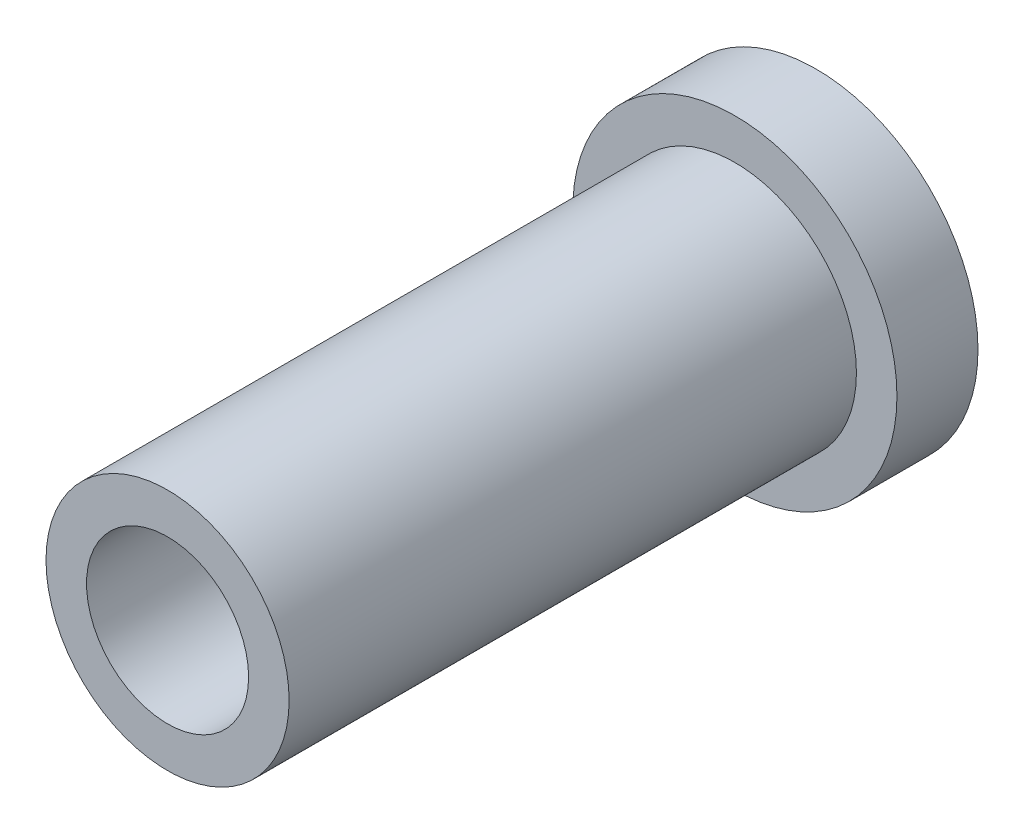
ISO-10303-21;
HEADER;
FILE_DESCRIPTION(('STEP AP214'),'2;1');
FILE_NAME('part.step','',(''),(''),'','','');
FILE_SCHEMA(('AUTOMOTIVE_DESIGN { 1 0 10303 214 1 1 1 1 }'));
ENDSEC;
DATA;
#1=APPLICATION_CONTEXT('core data for automotive mechanical design processes');
#2=APPLICATION_PROTOCOL_DEFINITION('international standard','automotive_design',2000,#1);
#3=PRODUCT_CONTEXT('',#1,'mechanical');
#4=PRODUCT('Part','Part','',(#3));
#5=PRODUCT_RELATED_PRODUCT_CATEGORY('part','',(#4));
#6=PRODUCT_DEFINITION_FORMATION('','',#4);
#7=PRODUCT_DEFINITION_CONTEXT('part definition',#1,'design');
#8=PRODUCT_DEFINITION('design','',#6,#7);
#9=PRODUCT_DEFINITION_SHAPE('','',#8);
#10=(LENGTH_UNIT() NAMED_UNIT(*) SI_UNIT(.MILLI.,.METRE.));
#11=(NAMED_UNIT(*) PLANE_ANGLE_UNIT() SI_UNIT($,.RADIAN.));
#12=(NAMED_UNIT(*) SI_UNIT($,.STERADIAN.) SOLID_ANGLE_UNIT());
#13=UNCERTAINTY_MEASURE_WITH_UNIT(LENGTH_MEASURE(1.E-05),#10,'distance_accuracy_value','');
#14=(GEOMETRIC_REPRESENTATION_CONTEXT(3) GLOBAL_UNCERTAINTY_ASSIGNED_CONTEXT((#13)) GLOBAL_UNIT_ASSIGNED_CONTEXT((#10,
#11,#12)) REPRESENTATION_CONTEXT('',''));
#15=CARTESIAN_POINT('',(0.,0.,0.));
#16=DIRECTION('',(0.,0.,1.));
#17=DIRECTION('',(1.,0.,0.));
#18=AXIS2_PLACEMENT_3D('',#15,#16,#17);
#19=CARTESIAN_POINT('',(1.37390348301041,0.601987723605646,2.));
#20=DIRECTION('',(0.,0.,1.));
#21=DIRECTION('',(1.,0.,0.));
#22=AXIS2_PLACEMENT_3D('',#19,#20,#21);
#23=PLANE('',#22);
#24=CARTESIAN_POINT('',(1.37390348301041,0.601987723605646,2.));
#25=DIRECTION('',(0.,0.,1.));
#26=DIRECTION('',(1.,0.,0.));
#27=AXIS2_PLACEMENT_3D('',#24,#25,#26);
#28=CIRCLE('',#27,4.);
#29=CARTESIAN_POINT('',(5.37390348301041,0.601987723605646,2.));
#30=VERTEX_POINT('',#29);
#31=EDGE_CURVE('E10',#30,#30,#28,.T.);
#32=ORIENTED_EDGE('',*,*,#31,.T.);
#33=EDGE_LOOP('',(#32));
#34=FACE_BOUND('',#33,.T.);
#35=CARTESIAN_POINT('',(1.37390348301041,0.601987723605642,2.));
#36=DIRECTION('',(0.,0.,1.));
#37=DIRECTION('',(1.,0.,0.));
#38=AXIS2_PLACEMENT_3D('',#35,#36,#37);
#39=CIRCLE('',#38,3.);
#40=CARTESIAN_POINT('',(4.37390348301041,0.601987723605642,2.));
#41=VERTEX_POINT('',#40);
#42=EDGE_CURVE('E46',#41,#41,#39,.T.);
#43=ORIENTED_EDGE('',*,*,#42,.F.);
#44=EDGE_LOOP('',(#43));
#45=FACE_BOUND('',#44,.T.);
#46=ADVANCED_FACE('F30',(#34,#45),#23,.T.);
#47=CARTESIAN_POINT('',(1.37390348301041,0.601987723605646,0.));
#48=DIRECTION('',(0.,0.,1.));
#49=DIRECTION('',(1.,0.,0.));
#50=AXIS2_PLACEMENT_3D('',#47,#48,#49);
#51=PLANE('',#50);
#52=CARTESIAN_POINT('',(1.37390348301041,0.601987723605646,0.));
#53=DIRECTION('',(0.,0.,1.));
#54=DIRECTION('',(1.,0.,0.));
#55=AXIS2_PLACEMENT_3D('',#52,#53,#54);
#56=CIRCLE('',#55,4.);
#57=CARTESIAN_POINT('',(5.37390348301041,0.601987723605646,0.));
#58=VERTEX_POINT('',#57);
#59=EDGE_CURVE('E34',#58,#58,#56,.T.);
#60=ORIENTED_EDGE('',*,*,#59,.F.);
#61=EDGE_LOOP('',(#60));
#62=FACE_BOUND('',#61,.T.);
#63=CARTESIAN_POINT('',(1.37390348301041,0.601987723605646,0.));
#64=DIRECTION('',(0.,0.,1.));
#65=DIRECTION('',(1.,0.,0.));
#66=AXIS2_PLACEMENT_3D('',#63,#64,#65);
#67=CIRCLE('',#66,2.);
#68=CARTESIAN_POINT('',(3.37390348301041,0.601987723605646,0.));
#69=VERTEX_POINT('',#68);
#70=EDGE_CURVE('E41',#69,#69,#67,.T.);
#71=ORIENTED_EDGE('',*,*,#70,.T.);
#72=EDGE_LOOP('',(#71));
#73=FACE_BOUND('',#72,.T.);
#74=ADVANCED_FACE('F71',(#62,#73),#51,.F.);
#75=CARTESIAN_POINT('',(1.37390348301041,0.601987723605646,2.));
#76=DIRECTION('',(0.,0.,-1.));
#77=DIRECTION('',(-1.,0.,0.));
#78=AXIS2_PLACEMENT_3D('',#75,#76,#77);
#79=CYLINDRICAL_SURFACE('',#78,4.);
#80=ORIENTED_EDGE('',*,*,#31,.F.);
#81=EDGE_LOOP('',(#80));
#82=FACE_BOUND('',#81,.T.);
#83=ORIENTED_EDGE('',*,*,#59,.T.);
#84=EDGE_LOOP('',(#83));
#85=FACE_BOUND('',#84,.T.);
#86=ADVANCED_FACE('F32',(#82,#85),#79,.T.);
#87=CARTESIAN_POINT('',(1.37390348301041,0.601987723605646,2.));
#88=DIRECTION('',(0.,0.,-1.));
#89=DIRECTION('',(-1.,0.,0.));
#90=AXIS2_PLACEMENT_3D('',#87,#88,#89);
#91=CYLINDRICAL_SURFACE('',#90,2.);
#92=ORIENTED_EDGE('',*,*,#70,.F.);
#93=EDGE_LOOP('',(#92));
#94=FACE_BOUND('',#93,.T.);
#95=CARTESIAN_POINT('',(1.37390348301041,0.601987723605642,16.));
#96=DIRECTION('',(0.,0.,1.));
#97=DIRECTION('',(1.,0.,0.));
#98=AXIS2_PLACEMENT_3D('',#95,#96,#97);
#99=CIRCLE('',#98,2.);
#100=CARTESIAN_POINT('',(3.37390348301041,0.601987723605642,16.));
#101=VERTEX_POINT('',#100);
#102=EDGE_CURVE('E49',#101,#101,#99,.T.);
#103=ORIENTED_EDGE('',*,*,#102,.T.);
#104=EDGE_LOOP('',(#103));
#105=FACE_BOUND('',#104,.T.);
#106=ADVANCED_FACE('F55',(#94,#105),#91,.F.);
#107=CARTESIAN_POINT('',(1.37390348301041,0.601987723605642,16.));
#108=DIRECTION('',(0.,0.,1.));
#109=DIRECTION('',(1.,0.,0.));
#110=AXIS2_PLACEMENT_3D('',#107,#108,#109);
#111=PLANE('',#110);
#112=CARTESIAN_POINT('',(1.37390348301041,0.601987723605642,16.));
#113=DIRECTION('',(0.,0.,1.));
#114=DIRECTION('',(1.,0.,0.));
#115=AXIS2_PLACEMENT_3D('',#112,#113,#114);
#116=CIRCLE('',#115,3.);
#117=CARTESIAN_POINT('',(4.37390348301041,0.601987723605642,16.));
#118=VERTEX_POINT('',#117);
#119=EDGE_CURVE('E45',#118,#118,#116,.T.);
#120=ORIENTED_EDGE('',*,*,#119,.T.);
#121=EDGE_LOOP('',(#120));
#122=FACE_BOUND('',#121,.T.);
#123=ORIENTED_EDGE('',*,*,#102,.F.);
#124=EDGE_LOOP('',(#123));
#125=FACE_BOUND('',#124,.T.);
#126=ADVANCED_FACE('F57',(#122,#125),#111,.T.);
#127=CARTESIAN_POINT('',(1.37390348301041,0.601987723605642,16.));
#128=DIRECTION('',(0.,0.,-1.));
#129=DIRECTION('',(-1.,0.,0.));
#130=AXIS2_PLACEMENT_3D('',#127,#128,#129);
#131=CYLINDRICAL_SURFACE('',#130,3.);
#132=ORIENTED_EDGE('',*,*,#119,.F.);
#133=EDGE_LOOP('',(#132));
#134=FACE_BOUND('',#133,.T.);
#135=ORIENTED_EDGE('',*,*,#42,.T.);
#136=EDGE_LOOP('',(#135));
#137=FACE_BOUND('',#136,.T.);
#138=ADVANCED_FACE('F59',(#134,#137),#131,.T.);
#139=CLOSED_SHELL('',(#46,#74,#86,#106,#126,#138));
#140=MANIFOLD_SOLID_BREP('B2',#139);
#141=ADVANCED_BREP_SHAPE_REPRESENTATION('',(#18,#140),#14);
#142=SHAPE_DEFINITION_REPRESENTATION(#9,#141);
ENDSEC;
END-ISO-10303-21;
